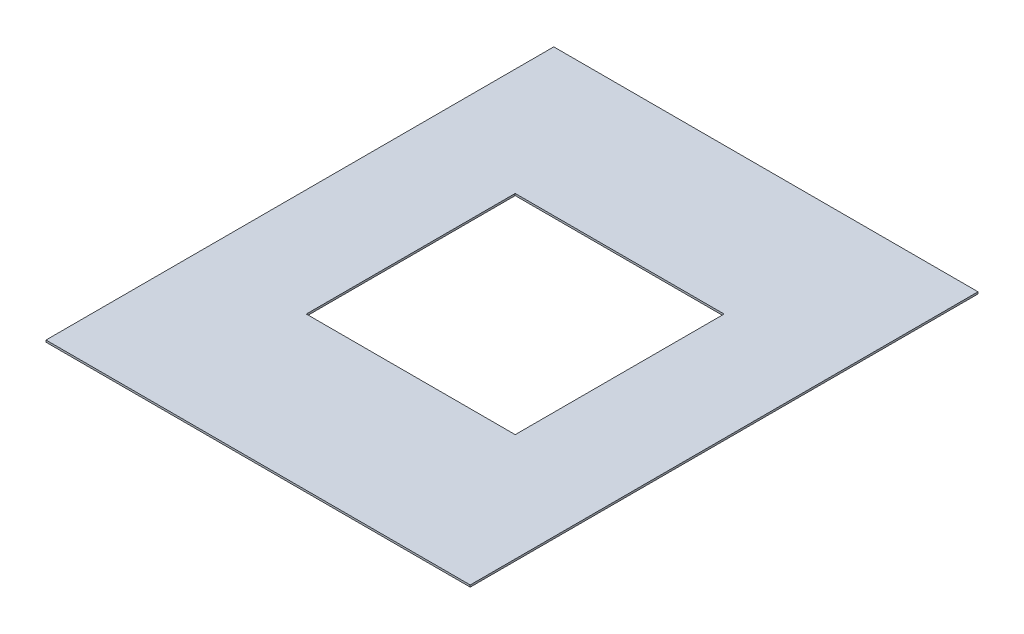
ISO-10303-21;
HEADER;
FILE_DESCRIPTION(('STEP AP214'),'2;1');
FILE_NAME('part.step','',(''),(''),'','','');
FILE_SCHEMA(('AUTOMOTIVE_DESIGN { 1 0 10303 214 1 1 1 1 }'));
ENDSEC;
DATA;
#1=APPLICATION_CONTEXT('core data for automotive mechanical design processes');
#2=APPLICATION_PROTOCOL_DEFINITION('international standard','automotive_design',2000,#1);
#3=PRODUCT_CONTEXT('',#1,'mechanical');
#4=PRODUCT('Part','Part','',(#3));
#5=PRODUCT_RELATED_PRODUCT_CATEGORY('part','',(#4));
#6=PRODUCT_DEFINITION_FORMATION('','',#4);
#7=PRODUCT_DEFINITION_CONTEXT('part definition',#1,'design');
#8=PRODUCT_DEFINITION('design','',#6,#7);
#9=PRODUCT_DEFINITION_SHAPE('','',#8);
#10=(LENGTH_UNIT() NAMED_UNIT(*) SI_UNIT(.MILLI.,.METRE.));
#11=(NAMED_UNIT(*) PLANE_ANGLE_UNIT() SI_UNIT($,.RADIAN.));
#12=(NAMED_UNIT(*) SI_UNIT($,.STERADIAN.) SOLID_ANGLE_UNIT());
#13=UNCERTAINTY_MEASURE_WITH_UNIT(LENGTH_MEASURE(1.E-05),#10,'distance_accuracy_value','');
#14=(GEOMETRIC_REPRESENTATION_CONTEXT(3) GLOBAL_UNCERTAINTY_ASSIGNED_CONTEXT((#13)) GLOBAL_UNIT_ASSIGNED_CONTEXT((#10,
#11,#12)) REPRESENTATION_CONTEXT('',''));
#15=CARTESIAN_POINT('',(0.,0.,0.));
#16=DIRECTION('',(0.,0.,1.));
#17=DIRECTION('',(1.,0.,0.));
#18=AXIS2_PLACEMENT_3D('',#15,#16,#17);
#19=CARTESIAN_POINT('',(20.,597.,-790.));
#20=DIRECTION('',(-1.,0.,0.));
#21=DIRECTION('',(0.,0.,1.));
#22=AXIS2_PLACEMENT_3D('',#19,#20,#21);
#23=PLANE('',#22);
#24=DIRECTION('',(0.,-1.,0.));
#25=VECTOR('',#24,1.);
#26=CARTESIAN_POINT('',(20.,597.,0.));
#27=LINE('',#26,#25);
#28=CARTESIAN_POINT('',(20.,600.,0.));
#29=VERTEX_POINT('',#28);
#30=CARTESIAN_POINT('',(20.,597.,0.));
#31=VERTEX_POINT('',#30);
#32=EDGE_CURVE('E138',#29,#31,#27,.T.);
#33=ORIENTED_EDGE('',*,*,#32,.F.);
#34=DIRECTION('',(0.,0.,1.));
#35=VECTOR('',#34,1.);
#36=CARTESIAN_POINT('',(20.,600.,-790.));
#37=LINE('',#36,#35);
#38=CARTESIAN_POINT('',(20.,600.,-790.));
#39=VERTEX_POINT('',#38);
#40=EDGE_CURVE('E105',#39,#29,#37,.T.);
#41=ORIENTED_EDGE('',*,*,#40,.F.);
#42=DIRECTION('',(0.,-1.,0.));
#43=VECTOR('',#42,1.);
#44=CARTESIAN_POINT('',(20.,597.,-790.));
#45=LINE('',#44,#43);
#46=CARTESIAN_POINT('',(20.,597.,-790.));
#47=VERTEX_POINT('',#46);
#48=EDGE_CURVE('E131',#39,#47,#45,.T.);
#49=ORIENTED_EDGE('',*,*,#48,.T.);
#50=DIRECTION('',(0.,0.,1.));
#51=VECTOR('',#50,1.);
#52=CARTESIAN_POINT('',(20.,597.,-790.));
#53=LINE('',#52,#51);
#54=EDGE_CURVE('E120',#47,#31,#53,.T.);
#55=ORIENTED_EDGE('',*,*,#54,.T.);
#56=EDGE_LOOP('',(#33,#41,#49,#55));
#57=FACE_BOUND('',#56,.T.);
#58=ADVANCED_FACE('F39',(#57),#23,.T.);
#59=CARTESIAN_POINT('',(20.,600.,-790.));
#60=DIRECTION('',(0.,1.,0.));
#61=DIRECTION('',(0.,0.,1.));
#62=AXIS2_PLACEMENT_3D('',#59,#60,#61);
#63=PLANE('',#62);
#64=DIRECTION('',(-1.,0.,0.));
#65=VECTOR('',#64,1.);
#66=CARTESIAN_POINT('',(20.,600.,-562.5));
#67=LINE('',#66,#65);
#68=CARTESIAN_POINT('',(512.5,600.,-562.5));
#69=VERTEX_POINT('',#68);
#70=CARTESIAN_POINT('',(187.5,600.,-562.5));
#71=VERTEX_POINT('',#70);
#72=EDGE_CURVE('E154',#69,#71,#67,.T.);
#73=ORIENTED_EDGE('',*,*,#72,.F.);
#74=DIRECTION('',(0.,0.,-1.));
#75=VECTOR('',#74,1.);
#76=CARTESIAN_POINT('',(512.5,600.,-790.));
#77=LINE('',#76,#75);
#78=CARTESIAN_POINT('',(512.5,600.,-237.5));
#79=VERTEX_POINT('',#78);
#80=EDGE_CURVE('E152',#79,#69,#77,.T.);
#81=ORIENTED_EDGE('',*,*,#80,.F.);
#82=DIRECTION('',(-1.,0.,0.));
#83=VECTOR('',#82,1.);
#84=CARTESIAN_POINT('',(20.,600.,-237.5));
#85=LINE('',#84,#83);
#86=CARTESIAN_POINT('',(187.5,600.,-237.5));
#87=VERTEX_POINT('',#86);
#88=EDGE_CURVE('E156',#79,#87,#85,.T.);
#89=ORIENTED_EDGE('',*,*,#88,.T.);
#90=DIRECTION('',(0.,0.,1.));
#91=VECTOR('',#90,1.);
#92=CARTESIAN_POINT('',(187.5,600.,-790.));
#93=LINE('',#92,#91);
#94=EDGE_CURVE('E112',#71,#87,#93,.T.);
#95=ORIENTED_EDGE('',*,*,#94,.F.);
#96=EDGE_LOOP('',(#73,#81,#89,#95));
#97=FACE_BOUND('',#96,.T.);
#98=DIRECTION('',(-1.,0.,0.));
#99=VECTOR('',#98,1.);
#100=CARTESIAN_POINT('',(20.,600.,0.));
#101=LINE('',#100,#99);
#102=CARTESIAN_POINT('',(680.,600.,0.));
#103=VERTEX_POINT('',#102);
#104=EDGE_CURVE('E128',#103,#29,#101,.T.);
#105=ORIENTED_EDGE('',*,*,#104,.F.);
#106=DIRECTION('',(0.,0.,1.));
#107=VECTOR('',#106,1.);
#108=CARTESIAN_POINT('',(680.,600.,-790.));
#109=LINE('',#108,#107);
#110=CARTESIAN_POINT('',(680.,600.,-790.));
#111=VERTEX_POINT('',#110);
#112=EDGE_CURVE('E125',#111,#103,#109,.T.);
#113=ORIENTED_EDGE('',*,*,#112,.F.);
#114=DIRECTION('',(-1.,0.,0.));
#115=VECTOR('',#114,1.);
#116=CARTESIAN_POINT('',(20.,600.,-790.));
#117=LINE('',#116,#115);
#118=EDGE_CURVE('E123',#111,#39,#117,.T.);
#119=ORIENTED_EDGE('',*,*,#118,.T.);
#120=ORIENTED_EDGE('',*,*,#40,.T.);
#121=EDGE_LOOP('',(#105,#113,#119,#120));
#122=FACE_BOUND('',#121,.T.);
#123=ADVANCED_FACE('F168',(#97,#122),#63,.T.);
#124=CARTESIAN_POINT('',(680.,597.,-790.));
#125=DIRECTION('',(1.,0.,0.));
#126=DIRECTION('',(0.,0.,-1.));
#127=AXIS2_PLACEMENT_3D('',#124,#125,#126);
#128=PLANE('',#127);
#129=DIRECTION('',(0.,1.,0.));
#130=VECTOR('',#129,1.);
#131=CARTESIAN_POINT('',(680.,597.,0.));
#132=LINE('',#131,#130);
#133=CARTESIAN_POINT('',(680.,597.,0.));
#134=VERTEX_POINT('',#133);
#135=EDGE_CURVE('E132',#134,#103,#132,.T.);
#136=ORIENTED_EDGE('',*,*,#135,.F.);
#137=DIRECTION('',(0.,0.,1.));
#138=VECTOR('',#137,1.);
#139=CARTESIAN_POINT('',(680.,597.,-790.));
#140=LINE('',#139,#138);
#141=CARTESIAN_POINT('',(680.,597.,-790.));
#142=VERTEX_POINT('',#141);
#143=EDGE_CURVE('E122',#142,#134,#140,.T.);
#144=ORIENTED_EDGE('',*,*,#143,.F.);
#145=DIRECTION('',(0.,1.,0.));
#146=VECTOR('',#145,1.);
#147=CARTESIAN_POINT('',(680.,597.,-790.));
#148=LINE('',#147,#146);
#149=EDGE_CURVE('E143',#142,#111,#148,.T.);
#150=ORIENTED_EDGE('',*,*,#149,.T.);
#151=ORIENTED_EDGE('',*,*,#112,.T.);
#152=EDGE_LOOP('',(#136,#144,#150,#151));
#153=FACE_BOUND('',#152,.T.);
#154=ADVANCED_FACE('F189',(#153),#128,.T.);
#155=CARTESIAN_POINT('',(20.,597.,-790.));
#156=DIRECTION('',(0.,-1.,0.));
#157=DIRECTION('',(0.,0.,-1.));
#158=AXIS2_PLACEMENT_3D('',#155,#156,#157);
#159=PLANE('',#158);
#160=DIRECTION('',(1.,0.,0.));
#161=VECTOR('',#160,1.);
#162=CARTESIAN_POINT('',(20.,597.,-562.5));
#163=LINE('',#162,#161);
#164=CARTESIAN_POINT('',(187.5,597.,-562.5));
#165=VERTEX_POINT('',#164);
#166=CARTESIAN_POINT('',(512.5,597.,-562.5));
#167=VERTEX_POINT('',#166);
#168=EDGE_CURVE('E11',#165,#167,#163,.T.);
#169=ORIENTED_EDGE('',*,*,#168,.F.);
#170=DIRECTION('',(0.,0.,-1.));
#171=VECTOR('',#170,1.);
#172=CARTESIAN_POINT('',(187.5,597.,-790.));
#173=LINE('',#172,#171);
#174=CARTESIAN_POINT('',(187.5,597.,-237.5));
#175=VERTEX_POINT('',#174);
#176=EDGE_CURVE('E46',#175,#165,#173,.T.);
#177=ORIENTED_EDGE('',*,*,#176,.F.);
#178=DIRECTION('',(1.,0.,0.));
#179=VECTOR('',#178,1.);
#180=CARTESIAN_POINT('',(20.,597.,-237.5));
#181=LINE('',#180,#179);
#182=CARTESIAN_POINT('',(512.5,597.,-237.5));
#183=VERTEX_POINT('',#182);
#184=EDGE_CURVE('E99',#175,#183,#181,.T.);
#185=ORIENTED_EDGE('',*,*,#184,.T.);
#186=DIRECTION('',(0.,0.,1.));
#187=VECTOR('',#186,1.);
#188=CARTESIAN_POINT('',(512.5,597.,-790.));
#189=LINE('',#188,#187);
#190=EDGE_CURVE('E104',#167,#183,#189,.T.);
#191=ORIENTED_EDGE('',*,*,#190,.F.);
#192=EDGE_LOOP('',(#169,#177,#185,#191));
#193=FACE_BOUND('',#192,.T.);
#194=DIRECTION('',(1.,0.,0.));
#195=VECTOR('',#194,1.);
#196=CARTESIAN_POINT('',(20.,597.,0.));
#197=LINE('',#196,#195);
#198=EDGE_CURVE('E135',#31,#134,#197,.T.);
#199=ORIENTED_EDGE('',*,*,#198,.F.);
#200=ORIENTED_EDGE('',*,*,#54,.F.);
#201=DIRECTION('',(1.,0.,0.));
#202=VECTOR('',#201,1.);
#203=CARTESIAN_POINT('',(20.,597.,-790.));
#204=LINE('',#203,#202);
#205=EDGE_CURVE('E146',#47,#142,#204,.T.);
#206=ORIENTED_EDGE('',*,*,#205,.T.);
#207=ORIENTED_EDGE('',*,*,#143,.T.);
#208=EDGE_LOOP('',(#199,#200,#206,#207));
#209=FACE_BOUND('',#208,.T.);
#210=ADVANCED_FACE('F116',(#193,#209),#159,.T.);
#211=CARTESIAN_POINT('',(0.,0.,-790.));
#212=DIRECTION('',(0.,0.,-1.));
#213=DIRECTION('',(-1.,0.,0.));
#214=AXIS2_PLACEMENT_3D('',#211,#212,#213);
#215=PLANE('',#214);
#216=ORIENTED_EDGE('',*,*,#48,.F.);
#217=ORIENTED_EDGE('',*,*,#118,.F.);
#218=ORIENTED_EDGE('',*,*,#149,.F.);
#219=ORIENTED_EDGE('',*,*,#205,.F.);
#220=EDGE_LOOP('',(#216,#217,#218,#219));
#221=FACE_BOUND('',#220,.T.);
#222=ADVANCED_FACE('F200',(#221),#215,.T.);
#223=CARTESIAN_POINT('',(0.,0.,0.));
#224=DIRECTION('',(0.,0.,-1.));
#225=DIRECTION('',(-1.,0.,0.));
#226=AXIS2_PLACEMENT_3D('',#223,#224,#225);
#227=PLANE('',#226);
#228=ORIENTED_EDGE('',*,*,#32,.T.);
#229=ORIENTED_EDGE('',*,*,#198,.T.);
#230=ORIENTED_EDGE('',*,*,#135,.T.);
#231=ORIENTED_EDGE('',*,*,#104,.T.);
#232=EDGE_LOOP('',(#228,#229,#230,#231));
#233=FACE_BOUND('',#232,.T.);
#234=ADVANCED_FACE('F180',(#233),#227,.F.);
#235=CARTESIAN_POINT('',(187.5,596.,-562.5));
#236=DIRECTION('',(-1.,0.,0.));
#237=DIRECTION('',(0.,0.,1.));
#238=AXIS2_PLACEMENT_3D('',#235,#236,#237);
#239=PLANE('',#238);
#240=ORIENTED_EDGE('',*,*,#94,.T.);
#241=DIRECTION('',(0.,-1.,0.));
#242=VECTOR('',#241,1.);
#243=CARTESIAN_POINT('',(187.5,596.,-237.5));
#244=LINE('',#243,#242);
#245=EDGE_CURVE('E53',#87,#175,#244,.T.);
#246=ORIENTED_EDGE('',*,*,#245,.T.);
#247=ORIENTED_EDGE('',*,*,#176,.T.);
#248=DIRECTION('',(0.,-1.,0.));
#249=VECTOR('',#248,1.);
#250=CARTESIAN_POINT('',(187.5,596.,-562.5));
#251=LINE('',#250,#249);
#252=EDGE_CURVE('E159',#71,#165,#251,.T.);
#253=ORIENTED_EDGE('',*,*,#252,.F.);
#254=EDGE_LOOP('',(#240,#246,#247,#253));
#255=FACE_BOUND('',#254,.T.);
#256=ADVANCED_FACE('F108',(#255),#239,.F.);
#257=CARTESIAN_POINT('',(512.5,596.,-562.5));
#258=DIRECTION('',(1.,0.,0.));
#259=DIRECTION('',(0.,0.,-1.));
#260=AXIS2_PLACEMENT_3D('',#257,#258,#259);
#261=PLANE('',#260);
#262=ORIENTED_EDGE('',*,*,#80,.T.);
#263=DIRECTION('',(0.,1.,0.));
#264=VECTOR('',#263,1.);
#265=CARTESIAN_POINT('',(512.5,596.,-562.5));
#266=LINE('',#265,#264);
#267=EDGE_CURVE('E158',#167,#69,#266,.T.);
#268=ORIENTED_EDGE('',*,*,#267,.F.);
#269=ORIENTED_EDGE('',*,*,#190,.T.);
#270=DIRECTION('',(0.,1.,0.));
#271=VECTOR('',#270,1.);
#272=CARTESIAN_POINT('',(512.5,596.,-237.5));
#273=LINE('',#272,#271);
#274=EDGE_CURVE('E58',#183,#79,#273,.T.);
#275=ORIENTED_EDGE('',*,*,#274,.T.);
#276=EDGE_LOOP('',(#262,#268,#269,#275));
#277=FACE_BOUND('',#276,.T.);
#278=ADVANCED_FACE('F172',(#277),#261,.F.);
#279=CARTESIAN_POINT('',(0.,0.,-562.5));
#280=DIRECTION('',(0.,0.,-1.));
#281=DIRECTION('',(-1.,0.,0.));
#282=AXIS2_PLACEMENT_3D('',#279,#280,#281);
#283=PLANE('',#282);
#284=ORIENTED_EDGE('',*,*,#72,.T.);
#285=ORIENTED_EDGE('',*,*,#252,.T.);
#286=ORIENTED_EDGE('',*,*,#168,.T.);
#287=ORIENTED_EDGE('',*,*,#267,.T.);
#288=EDGE_LOOP('',(#284,#285,#286,#287));
#289=FACE_BOUND('',#288,.T.);
#290=ADVANCED_FACE('F164',(#289),#283,.F.);
#291=CARTESIAN_POINT('',(0.,0.,-237.5));
#292=DIRECTION('',(0.,0.,-1.));
#293=DIRECTION('',(-1.,0.,0.));
#294=AXIS2_PLACEMENT_3D('',#291,#292,#293);
#295=PLANE('',#294);
#296=ORIENTED_EDGE('',*,*,#274,.F.);
#297=ORIENTED_EDGE('',*,*,#184,.F.);
#298=ORIENTED_EDGE('',*,*,#245,.F.);
#299=ORIENTED_EDGE('',*,*,#88,.F.);
#300=EDGE_LOOP('',(#296,#297,#298,#299));
#301=FACE_BOUND('',#300,.T.);
#302=ADVANCED_FACE('F100',(#301),#295,.T.);
#303=CLOSED_SHELL('',(#58,#123,#154,#210,#222,#234,#256,#278,#290,#302));
#304=MANIFOLD_SOLID_BREP('B2',#303);
#305=ADVANCED_BREP_SHAPE_REPRESENTATION('',(#18,#304),#14);
#306=SHAPE_DEFINITION_REPRESENTATION(#9,#305);
ENDSEC;
END-ISO-10303-21;
